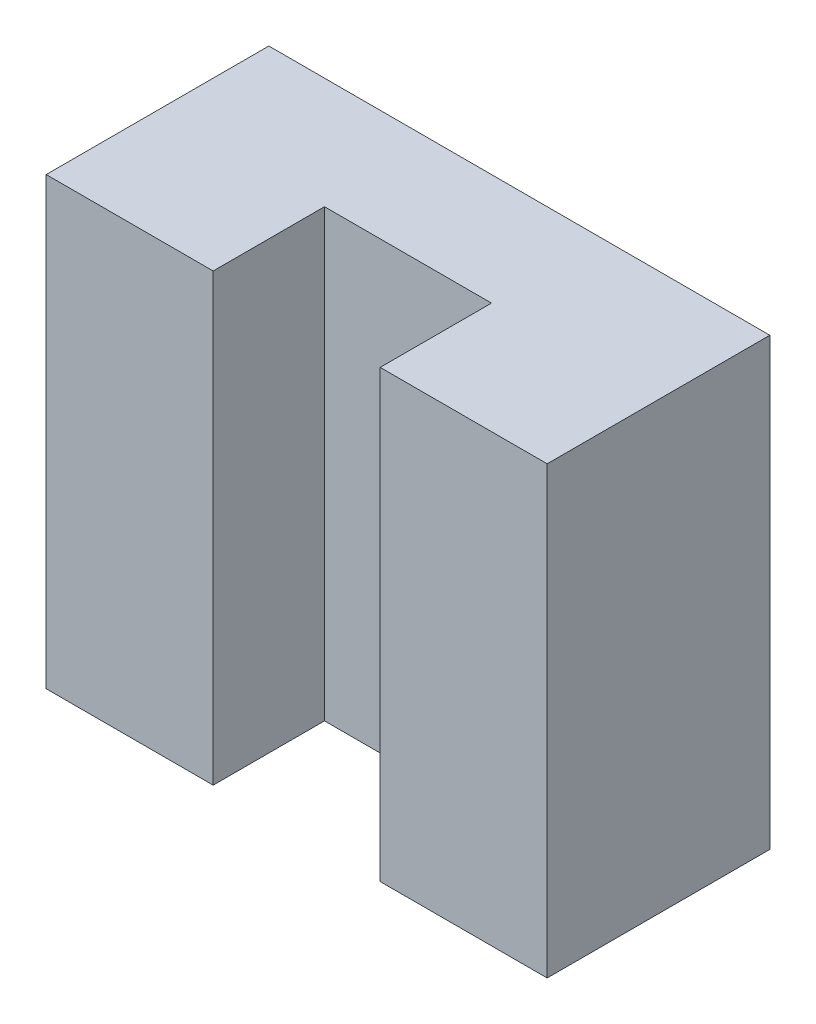
ISO-10303-21;
HEADER;
FILE_DESCRIPTION(('STEP AP214'),'2;1');
FILE_NAME('part.step','',(''),(''),'','','');
FILE_SCHEMA(('AUTOMOTIVE_DESIGN { 1 0 10303 214 1 1 1 1 }'));
ENDSEC;
DATA;
#1=APPLICATION_CONTEXT('core data for automotive mechanical design processes');
#2=APPLICATION_PROTOCOL_DEFINITION('international standard','automotive_design',2000,#1);
#3=PRODUCT_CONTEXT('',#1,'mechanical');
#4=PRODUCT('Part','Part','',(#3));
#5=PRODUCT_RELATED_PRODUCT_CATEGORY('part','',(#4));
#6=PRODUCT_DEFINITION_FORMATION('','',#4);
#7=PRODUCT_DEFINITION_CONTEXT('part definition',#1,'design');
#8=PRODUCT_DEFINITION('design','',#6,#7);
#9=PRODUCT_DEFINITION_SHAPE('','',#8);
#10=(LENGTH_UNIT() NAMED_UNIT(*) SI_UNIT(.MILLI.,.METRE.));
#11=(NAMED_UNIT(*) PLANE_ANGLE_UNIT() SI_UNIT($,.RADIAN.));
#12=(NAMED_UNIT(*) SI_UNIT($,.STERADIAN.) SOLID_ANGLE_UNIT());
#13=UNCERTAINTY_MEASURE_WITH_UNIT(LENGTH_MEASURE(1.E-05),#10,'distance_accuracy_value','');
#14=(GEOMETRIC_REPRESENTATION_CONTEXT(3) GLOBAL_UNCERTAINTY_ASSIGNED_CONTEXT((#13)) GLOBAL_UNIT_ASSIGNED_CONTEXT((#10,
#11,#12)) REPRESENTATION_CONTEXT('',''));
#15=CARTESIAN_POINT('',(0.,0.,0.));
#16=DIRECTION('',(0.,0.,1.));
#17=DIRECTION('',(1.,0.,0.));
#18=AXIS2_PLACEMENT_3D('',#15,#16,#17);
#19=CARTESIAN_POINT('',(0.,80.,0.));
#20=DIRECTION('',(1.,0.,0.));
#21=DIRECTION('',(0.,0.,-1.));
#22=AXIS2_PLACEMENT_3D('',#19,#20,#21);
#23=PLANE('',#22);
#24=DIRECTION('',(0.,0.,1.));
#25=VECTOR('',#24,1.);
#26=CARTESIAN_POINT('',(0.,0.,0.));
#27=LINE('',#26,#25);
#28=CARTESIAN_POINT('',(0.,0.,-40.));
#29=VERTEX_POINT('',#28);
#30=CARTESIAN_POINT('',(0.,0.,0.));
#31=VERTEX_POINT('',#30);
#32=EDGE_CURVE('E129',#29,#31,#27,.T.);
#33=ORIENTED_EDGE('',*,*,#32,.T.);
#34=DIRECTION('',(0.,-1.,0.));
#35=VECTOR('',#34,1.);
#36=CARTESIAN_POINT('',(0.,80.,0.));
#37=LINE('',#36,#35);
#38=CARTESIAN_POINT('',(0.,80.,0.));
#39=VERTEX_POINT('',#38);
#40=EDGE_CURVE('E11',#39,#31,#37,.T.);
#41=ORIENTED_EDGE('',*,*,#40,.F.);
#42=DIRECTION('',(0.,0.,1.));
#43=VECTOR('',#42,1.);
#44=CARTESIAN_POINT('',(0.,80.,0.));
#45=LINE('',#44,#43);
#46=CARTESIAN_POINT('',(0.,80.,-40.));
#47=VERTEX_POINT('',#46);
#48=EDGE_CURVE('E143',#47,#39,#45,.T.);
#49=ORIENTED_EDGE('',*,*,#48,.F.);
#50=DIRECTION('',(0.,-1.,0.));
#51=VECTOR('',#50,1.);
#52=CARTESIAN_POINT('',(0.,80.,-40.));
#53=LINE('',#52,#51);
#54=EDGE_CURVE('E125',#47,#29,#53,.T.);
#55=ORIENTED_EDGE('',*,*,#54,.T.);
#56=EDGE_LOOP('',(#33,#41,#49,#55));
#57=FACE_BOUND('',#56,.T.);
#58=ADVANCED_FACE('F33',(#57),#23,.F.);
#59=CARTESIAN_POINT('',(0.,80.,0.));
#60=DIRECTION('',(0.,0.,-1.));
#61=DIRECTION('',(-1.,0.,0.));
#62=AXIS2_PLACEMENT_3D('',#59,#60,#61);
#63=PLANE('',#62);
#64=DIRECTION('',(1.,0.,0.));
#65=VECTOR('',#64,1.);
#66=CARTESIAN_POINT('',(0.,0.,0.));
#67=LINE('',#66,#65);
#68=CARTESIAN_POINT('',(30.,0.,0.));
#69=VERTEX_POINT('',#68);
#70=EDGE_CURVE('E132',#31,#69,#67,.T.);
#71=ORIENTED_EDGE('',*,*,#70,.T.);
#72=DIRECTION('',(0.,-1.,0.));
#73=VECTOR('',#72,1.);
#74=CARTESIAN_POINT('',(30.,80.,0.));
#75=LINE('',#74,#73);
#76=CARTESIAN_POINT('',(30.,80.,0.));
#77=VERTEX_POINT('',#76);
#78=EDGE_CURVE('E41',#77,#69,#75,.T.);
#79=ORIENTED_EDGE('',*,*,#78,.F.);
#80=DIRECTION('',(1.,0.,0.));
#81=VECTOR('',#80,1.);
#82=CARTESIAN_POINT('',(0.,80.,0.));
#83=LINE('',#82,#81);
#84=EDGE_CURVE('E92',#39,#77,#83,.T.);
#85=ORIENTED_EDGE('',*,*,#84,.F.);
#86=ORIENTED_EDGE('',*,*,#40,.T.);
#87=EDGE_LOOP('',(#71,#79,#85,#86));
#88=FACE_BOUND('',#87,.T.);
#89=ADVANCED_FACE('F178',(#88),#63,.F.);
#90=CARTESIAN_POINT('',(30.,80.,0.));
#91=DIRECTION('',(-1.,0.,0.));
#92=DIRECTION('',(0.,0.,1.));
#93=AXIS2_PLACEMENT_3D('',#90,#91,#92);
#94=PLANE('',#93);
#95=DIRECTION('',(0.,0.,-1.));
#96=VECTOR('',#95,1.);
#97=CARTESIAN_POINT('',(30.,0.,0.));
#98=LINE('',#97,#96);
#99=CARTESIAN_POINT('',(30.,0.,-20.));
#100=VERTEX_POINT('',#99);
#101=EDGE_CURVE('E134',#69,#100,#98,.T.);
#102=ORIENTED_EDGE('',*,*,#101,.T.);
#103=DIRECTION('',(0.,-1.,0.));
#104=VECTOR('',#103,1.);
#105=CARTESIAN_POINT('',(30.,80.,-20.));
#106=LINE('',#105,#104);
#107=CARTESIAN_POINT('',(30.,80.,-20.));
#108=VERTEX_POINT('',#107);
#109=EDGE_CURVE('E150',#108,#100,#106,.T.);
#110=ORIENTED_EDGE('',*,*,#109,.F.);
#111=DIRECTION('',(0.,0.,-1.));
#112=VECTOR('',#111,1.);
#113=CARTESIAN_POINT('',(30.,80.,0.));
#114=LINE('',#113,#112);
#115=EDGE_CURVE('E158',#77,#108,#114,.T.);
#116=ORIENTED_EDGE('',*,*,#115,.F.);
#117=ORIENTED_EDGE('',*,*,#78,.T.);
#118=EDGE_LOOP('',(#102,#110,#116,#117));
#119=FACE_BOUND('',#118,.T.);
#120=ADVANCED_FACE('F156',(#119),#94,.F.);
#121=CARTESIAN_POINT('',(30.,80.,-20.));
#122=DIRECTION('',(0.,0.,-1.));
#123=DIRECTION('',(-1.,0.,0.));
#124=AXIS2_PLACEMENT_3D('',#121,#122,#123);
#125=PLANE('',#124);
#126=DIRECTION('',(1.,0.,0.));
#127=VECTOR('',#126,1.);
#128=CARTESIAN_POINT('',(30.,0.,-20.));
#129=LINE('',#128,#127);
#130=CARTESIAN_POINT('',(60.,0.,-20.));
#131=VERTEX_POINT('',#130);
#132=EDGE_CURVE('E136',#100,#131,#129,.T.);
#133=ORIENTED_EDGE('',*,*,#132,.T.);
#134=DIRECTION('',(0.,-1.,0.));
#135=VECTOR('',#134,1.);
#136=CARTESIAN_POINT('',(60.,80.,-20.));
#137=LINE('',#136,#135);
#138=CARTESIAN_POINT('',(60.,80.,-20.));
#139=VERTEX_POINT('',#138);
#140=EDGE_CURVE('E147',#139,#131,#137,.T.);
#141=ORIENTED_EDGE('',*,*,#140,.F.);
#142=DIRECTION('',(1.,0.,0.));
#143=VECTOR('',#142,1.);
#144=CARTESIAN_POINT('',(30.,80.,-20.));
#145=LINE('',#144,#143);
#146=EDGE_CURVE('E170',#108,#139,#145,.T.);
#147=ORIENTED_EDGE('',*,*,#146,.F.);
#148=ORIENTED_EDGE('',*,*,#109,.T.);
#149=EDGE_LOOP('',(#133,#141,#147,#148));
#150=FACE_BOUND('',#149,.T.);
#151=ADVANCED_FACE('F166',(#150),#125,.F.);
#152=CARTESIAN_POINT('',(60.,80.,0.));
#153=DIRECTION('',(1.,0.,0.));
#154=DIRECTION('',(0.,0.,-1.));
#155=AXIS2_PLACEMENT_3D('',#152,#153,#154);
#156=PLANE('',#155);
#157=DIRECTION('',(0.,0.,1.));
#158=VECTOR('',#157,1.);
#159=CARTESIAN_POINT('',(60.,0.,0.));
#160=LINE('',#159,#158);
#161=CARTESIAN_POINT('',(60.,0.,0.));
#162=VERTEX_POINT('',#161);
#163=EDGE_CURVE('E138',#131,#162,#160,.T.);
#164=ORIENTED_EDGE('',*,*,#163,.T.);
#165=DIRECTION('',(0.,-1.,0.));
#166=VECTOR('',#165,1.);
#167=CARTESIAN_POINT('',(60.,80.,0.));
#168=LINE('',#167,#166);
#169=CARTESIAN_POINT('',(60.,80.,0.));
#170=VERTEX_POINT('',#169);
#171=EDGE_CURVE('E120',#170,#162,#168,.T.);
#172=ORIENTED_EDGE('',*,*,#171,.F.);
#173=DIRECTION('',(0.,0.,1.));
#174=VECTOR('',#173,1.);
#175=CARTESIAN_POINT('',(60.,80.,0.));
#176=LINE('',#175,#174);
#177=EDGE_CURVE('E111',#139,#170,#176,.T.);
#178=ORIENTED_EDGE('',*,*,#177,.F.);
#179=ORIENTED_EDGE('',*,*,#140,.T.);
#180=EDGE_LOOP('',(#164,#172,#178,#179));
#181=FACE_BOUND('',#180,.T.);
#182=ADVANCED_FACE('F169',(#181),#156,.F.);
#183=CARTESIAN_POINT('',(60.,80.,0.));
#184=DIRECTION('',(0.,0.,-1.));
#185=DIRECTION('',(-1.,0.,0.));
#186=AXIS2_PLACEMENT_3D('',#183,#184,#185);
#187=PLANE('',#186);
#188=DIRECTION('',(1.,0.,0.));
#189=VECTOR('',#188,1.);
#190=CARTESIAN_POINT('',(60.,0.,0.));
#191=LINE('',#190,#189);
#192=CARTESIAN_POINT('',(90.,0.,0.));
#193=VERTEX_POINT('',#192);
#194=EDGE_CURVE('E119',#162,#193,#191,.T.);
#195=ORIENTED_EDGE('',*,*,#194,.T.);
#196=DIRECTION('',(0.,-1.,0.));
#197=VECTOR('',#196,1.);
#198=CARTESIAN_POINT('',(90.,80.,0.));
#199=LINE('',#198,#197);
#200=CARTESIAN_POINT('',(90.,80.,0.));
#201=VERTEX_POINT('',#200);
#202=EDGE_CURVE('E116',#201,#193,#199,.T.);
#203=ORIENTED_EDGE('',*,*,#202,.F.);
#204=DIRECTION('',(1.,0.,0.));
#205=VECTOR('',#204,1.);
#206=CARTESIAN_POINT('',(60.,80.,0.));
#207=LINE('',#206,#205);
#208=EDGE_CURVE('E105',#170,#201,#207,.T.);
#209=ORIENTED_EDGE('',*,*,#208,.F.);
#210=ORIENTED_EDGE('',*,*,#171,.T.);
#211=EDGE_LOOP('',(#195,#203,#209,#210));
#212=FACE_BOUND('',#211,.T.);
#213=ADVANCED_FACE('F117',(#212),#187,.F.);
#214=CARTESIAN_POINT('',(90.,80.,0.));
#215=DIRECTION('',(-1.,0.,0.));
#216=DIRECTION('',(0.,0.,1.));
#217=AXIS2_PLACEMENT_3D('',#214,#215,#216);
#218=PLANE('',#217);
#219=DIRECTION('',(0.,0.,-1.));
#220=VECTOR('',#219,1.);
#221=CARTESIAN_POINT('',(90.,0.,0.));
#222=LINE('',#221,#220);
#223=CARTESIAN_POINT('',(90.,0.,-40.));
#224=VERTEX_POINT('',#223);
#225=EDGE_CURVE('E78',#193,#224,#222,.T.);
#226=ORIENTED_EDGE('',*,*,#225,.T.);
#227=DIRECTION('',(0.,-1.,0.));
#228=VECTOR('',#227,1.);
#229=CARTESIAN_POINT('',(90.,80.,-40.));
#230=LINE('',#229,#228);
#231=CARTESIAN_POINT('',(90.,80.,-40.));
#232=VERTEX_POINT('',#231);
#233=EDGE_CURVE('E121',#232,#224,#230,.T.);
#234=ORIENTED_EDGE('',*,*,#233,.F.);
#235=DIRECTION('',(0.,0.,-1.));
#236=VECTOR('',#235,1.);
#237=CARTESIAN_POINT('',(90.,80.,0.));
#238=LINE('',#237,#236);
#239=EDGE_CURVE('E109',#201,#232,#238,.T.);
#240=ORIENTED_EDGE('',*,*,#239,.F.);
#241=ORIENTED_EDGE('',*,*,#202,.T.);
#242=EDGE_LOOP('',(#226,#234,#240,#241));
#243=FACE_BOUND('',#242,.T.);
#244=ADVANCED_FACE('F123',(#243),#218,.F.);
#245=CARTESIAN_POINT('',(0.,80.,-40.));
#246=DIRECTION('',(0.,0.,1.));
#247=DIRECTION('',(1.,0.,0.));
#248=AXIS2_PLACEMENT_3D('',#245,#246,#247);
#249=PLANE('',#248);
#250=DIRECTION('',(-1.,0.,0.));
#251=VECTOR('',#250,1.);
#252=CARTESIAN_POINT('',(0.,0.,-40.));
#253=LINE('',#252,#251);
#254=EDGE_CURVE('E84',#224,#29,#253,.T.);
#255=ORIENTED_EDGE('',*,*,#254,.T.);
#256=ORIENTED_EDGE('',*,*,#54,.F.);
#257=DIRECTION('',(-1.,0.,0.));
#258=VECTOR('',#257,1.);
#259=CARTESIAN_POINT('',(0.,80.,-40.));
#260=LINE('',#259,#258);
#261=EDGE_CURVE('E49',#232,#47,#260,.T.);
#262=ORIENTED_EDGE('',*,*,#261,.F.);
#263=ORIENTED_EDGE('',*,*,#233,.T.);
#264=EDGE_LOOP('',(#255,#256,#262,#263));
#265=FACE_BOUND('',#264,.T.);
#266=ADVANCED_FACE('F194',(#265),#249,.F.);
#267=CARTESIAN_POINT('',(0.,80.,0.));
#268=DIRECTION('',(0.,-1.,0.));
#269=DIRECTION('',(0.,0.,-1.));
#270=AXIS2_PLACEMENT_3D('',#267,#268,#269);
#271=PLANE('',#270);
#272=ORIENTED_EDGE('',*,*,#48,.T.);
#273=ORIENTED_EDGE('',*,*,#84,.T.);
#274=ORIENTED_EDGE('',*,*,#115,.T.);
#275=ORIENTED_EDGE('',*,*,#146,.T.);
#276=ORIENTED_EDGE('',*,*,#177,.T.);
#277=ORIENTED_EDGE('',*,*,#208,.T.);
#278=ORIENTED_EDGE('',*,*,#239,.T.);
#279=ORIENTED_EDGE('',*,*,#261,.T.);
#280=EDGE_LOOP('',(#272,#273,#274,#275,#276,#277,#278,#279));
#281=FACE_BOUND('',#280,.T.);
#282=ADVANCED_FACE('F107',(#281),#271,.F.);
#283=CARTESIAN_POINT('',(0.,0.,0.));
#284=DIRECTION('',(0.,-1.,0.));
#285=DIRECTION('',(0.,0.,-1.));
#286=AXIS2_PLACEMENT_3D('',#283,#284,#285);
#287=PLANE('',#286);
#288=ORIENTED_EDGE('',*,*,#32,.F.);
#289=ORIENTED_EDGE('',*,*,#254,.F.);
#290=ORIENTED_EDGE('',*,*,#225,.F.);
#291=ORIENTED_EDGE('',*,*,#194,.F.);
#292=ORIENTED_EDGE('',*,*,#163,.F.);
#293=ORIENTED_EDGE('',*,*,#132,.F.);
#294=ORIENTED_EDGE('',*,*,#101,.F.);
#295=ORIENTED_EDGE('',*,*,#70,.F.);
#296=EDGE_LOOP('',(#288,#289,#290,#291,#292,#293,#294,#295));
#297=FACE_BOUND('',#296,.T.);
#298=ADVANCED_FACE('F162',(#297),#287,.T.);
#299=CLOSED_SHELL('',(#58,#89,#120,#151,#182,#213,#244,#266,#282,#298));
#300=MANIFOLD_SOLID_BREP('B2',#299);
#301=ADVANCED_BREP_SHAPE_REPRESENTATION('',(#18,#300),#14);
#302=SHAPE_DEFINITION_REPRESENTATION(#9,#301);
ENDSEC;
END-ISO-10303-21;
